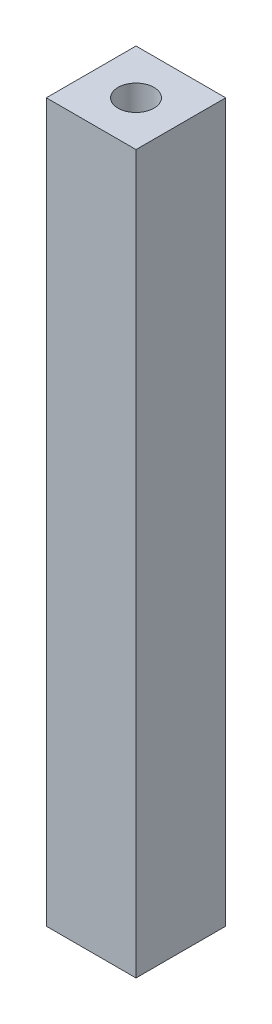
ISO-10303-21;
HEADER;
FILE_DESCRIPTION(('STEP AP214'),'2;1');
FILE_NAME('part.step','',(''),(''),'','','');
FILE_SCHEMA(('AUTOMOTIVE_DESIGN { 1 0 10303 214 1 1 1 1 }'));
ENDSEC;
DATA;
#1=APPLICATION_CONTEXT('core data for automotive mechanical design processes');
#2=APPLICATION_PROTOCOL_DEFINITION('international standard','automotive_design',2000,#1);
#3=PRODUCT_CONTEXT('',#1,'mechanical');
#4=PRODUCT('Part','Part','',(#3));
#5=PRODUCT_RELATED_PRODUCT_CATEGORY('part','',(#4));
#6=PRODUCT_DEFINITION_FORMATION('','',#4);
#7=PRODUCT_DEFINITION_CONTEXT('part definition',#1,'design');
#8=PRODUCT_DEFINITION('design','',#6,#7);
#9=PRODUCT_DEFINITION_SHAPE('','',#8);
#10=(LENGTH_UNIT() NAMED_UNIT(*) SI_UNIT(.MILLI.,.METRE.));
#11=(NAMED_UNIT(*) PLANE_ANGLE_UNIT() SI_UNIT($,.RADIAN.));
#12=(NAMED_UNIT(*) SI_UNIT($,.STERADIAN.) SOLID_ANGLE_UNIT());
#13=UNCERTAINTY_MEASURE_WITH_UNIT(LENGTH_MEASURE(1.E-05),#10,'distance_accuracy_value','');
#14=(GEOMETRIC_REPRESENTATION_CONTEXT(3) GLOBAL_UNCERTAINTY_ASSIGNED_CONTEXT((#13)) GLOBAL_UNIT_ASSIGNED_CONTEXT((#10,
#11,#12)) REPRESENTATION_CONTEXT('',''));
#15=CARTESIAN_POINT('',(0.,0.,0.));
#16=DIRECTION('',(0.,0.,1.));
#17=DIRECTION('',(1.,0.,0.));
#18=AXIS2_PLACEMENT_3D('',#15,#16,#17);
#19=CARTESIAN_POINT('',(0.,101.6,0.));
#20=DIRECTION('',(1.,0.,0.));
#21=DIRECTION('',(0.,0.,-1.));
#22=AXIS2_PLACEMENT_3D('',#19,#20,#21);
#23=PLANE('',#22);
#24=DIRECTION('',(0.,0.,1.));
#25=VECTOR('',#24,1.);
#26=CARTESIAN_POINT('',(0.,0.,0.));
#27=LINE('',#26,#25);
#28=CARTESIAN_POINT('',(0.,0.,0.));
#29=VERTEX_POINT('',#28);
#30=CARTESIAN_POINT('',(0.,0.,12.7));
#31=VERTEX_POINT('',#30);
#32=EDGE_CURVE('E110',#29,#31,#27,.T.);
#33=ORIENTED_EDGE('',*,*,#32,.T.);
#34=DIRECTION('',(0.,-1.,0.));
#35=VECTOR('',#34,1.);
#36=CARTESIAN_POINT('',(0.,101.6,12.7));
#37=LINE('',#36,#35);
#38=CARTESIAN_POINT('',(0.,101.6,12.7));
#39=VERTEX_POINT('',#38);
#40=EDGE_CURVE('E11',#39,#31,#37,.T.);
#41=ORIENTED_EDGE('',*,*,#40,.F.);
#42=DIRECTION('',(0.,0.,1.));
#43=VECTOR('',#42,1.);
#44=CARTESIAN_POINT('',(0.,101.6,0.));
#45=LINE('',#44,#43);
#46=CARTESIAN_POINT('',(0.,101.6,0.));
#47=VERTEX_POINT('',#46);
#48=EDGE_CURVE('E111',#47,#39,#45,.T.);
#49=ORIENTED_EDGE('',*,*,#48,.F.);
#50=DIRECTION('',(0.,-1.,0.));
#51=VECTOR('',#50,1.);
#52=CARTESIAN_POINT('',(0.,101.6,0.));
#53=LINE('',#52,#51);
#54=EDGE_CURVE('E117',#47,#29,#53,.T.);
#55=ORIENTED_EDGE('',*,*,#54,.T.);
#56=EDGE_LOOP('',(#33,#41,#49,#55));
#57=FACE_BOUND('',#56,.T.);
#58=ADVANCED_FACE('F35',(#57),#23,.F.);
#59=CARTESIAN_POINT('',(0.,101.6,12.7));
#60=DIRECTION('',(0.,0.,-1.));
#61=DIRECTION('',(-1.,0.,0.));
#62=AXIS2_PLACEMENT_3D('',#59,#60,#61);
#63=PLANE('',#62);
#64=DIRECTION('',(1.,0.,0.));
#65=VECTOR('',#64,1.);
#66=CARTESIAN_POINT('',(0.,0.,12.7));
#67=LINE('',#66,#65);
#68=CARTESIAN_POINT('',(12.7,0.,12.7));
#69=VERTEX_POINT('',#68);
#70=EDGE_CURVE('E120',#31,#69,#67,.T.);
#71=ORIENTED_EDGE('',*,*,#70,.T.);
#72=DIRECTION('',(0.,-1.,0.));
#73=VECTOR('',#72,1.);
#74=CARTESIAN_POINT('',(12.7,101.6,12.7));
#75=LINE('',#74,#73);
#76=CARTESIAN_POINT('',(12.7,101.6,12.7));
#77=VERTEX_POINT('',#76);
#78=EDGE_CURVE('E43',#77,#69,#75,.T.);
#79=ORIENTED_EDGE('',*,*,#78,.F.);
#80=DIRECTION('',(1.,0.,0.));
#81=VECTOR('',#80,1.);
#82=CARTESIAN_POINT('',(0.,101.6,12.7));
#83=LINE('',#82,#81);
#84=EDGE_CURVE('E82',#39,#77,#83,.T.);
#85=ORIENTED_EDGE('',*,*,#84,.F.);
#86=ORIENTED_EDGE('',*,*,#40,.T.);
#87=EDGE_LOOP('',(#71,#79,#85,#86));
#88=FACE_BOUND('',#87,.T.);
#89=ADVANCED_FACE('F144',(#88),#63,.F.);
#90=CARTESIAN_POINT('',(12.7,101.6,0.));
#91=DIRECTION('',(-1.,0.,0.));
#92=DIRECTION('',(0.,0.,1.));
#93=AXIS2_PLACEMENT_3D('',#90,#91,#92);
#94=PLANE('',#93);
#95=DIRECTION('',(0.,0.,-1.));
#96=VECTOR('',#95,1.);
#97=CARTESIAN_POINT('',(12.7,0.,0.));
#98=LINE('',#97,#96);
#99=CARTESIAN_POINT('',(12.7,0.,0.));
#100=VERTEX_POINT('',#99);
#101=EDGE_CURVE('E69',#69,#100,#98,.T.);
#102=ORIENTED_EDGE('',*,*,#101,.T.);
#103=DIRECTION('',(0.,-1.,0.));
#104=VECTOR('',#103,1.);
#105=CARTESIAN_POINT('',(12.7,101.6,0.));
#106=LINE('',#105,#104);
#107=CARTESIAN_POINT('',(12.7,101.6,0.));
#108=VERTEX_POINT('',#107);
#109=EDGE_CURVE('E125',#108,#100,#106,.T.);
#110=ORIENTED_EDGE('',*,*,#109,.F.);
#111=DIRECTION('',(0.,0.,-1.));
#112=VECTOR('',#111,1.);
#113=CARTESIAN_POINT('',(12.7,101.6,0.));
#114=LINE('',#113,#112);
#115=EDGE_CURVE('E114',#77,#108,#114,.T.);
#116=ORIENTED_EDGE('',*,*,#115,.F.);
#117=ORIENTED_EDGE('',*,*,#78,.T.);
#118=EDGE_LOOP('',(#102,#110,#116,#117));
#119=FACE_BOUND('',#118,.T.);
#120=ADVANCED_FACE('F127',(#119),#94,.F.);
#121=CARTESIAN_POINT('',(0.,101.6,0.));
#122=DIRECTION('',(0.,0.,1.));
#123=DIRECTION('',(1.,0.,0.));
#124=AXIS2_PLACEMENT_3D('',#121,#122,#123);
#125=PLANE('',#124);
#126=DIRECTION('',(-1.,0.,0.));
#127=VECTOR('',#126,1.);
#128=CARTESIAN_POINT('',(0.,0.,0.));
#129=LINE('',#128,#127);
#130=EDGE_CURVE('E75',#100,#29,#129,.T.);
#131=ORIENTED_EDGE('',*,*,#130,.T.);
#132=ORIENTED_EDGE('',*,*,#54,.F.);
#133=DIRECTION('',(-1.,0.,0.));
#134=VECTOR('',#133,1.);
#135=CARTESIAN_POINT('',(0.,101.6,0.));
#136=LINE('',#135,#134);
#137=EDGE_CURVE('E51',#108,#47,#136,.T.);
#138=ORIENTED_EDGE('',*,*,#137,.F.);
#139=ORIENTED_EDGE('',*,*,#109,.T.);
#140=EDGE_LOOP('',(#131,#132,#138,#139));
#141=FACE_BOUND('',#140,.T.);
#142=ADVANCED_FACE('F134',(#141),#125,.F.);
#143=CARTESIAN_POINT('',(0.,101.6,0.));
#144=DIRECTION('',(0.,1.,0.));
#145=DIRECTION('',(0.,0.,1.));
#146=AXIS2_PLACEMENT_3D('',#143,#144,#145);
#147=PLANE('',#146);
#148=CARTESIAN_POINT('',(6.35,101.6,6.35));
#149=DIRECTION('',(0.,1.,0.));
#150=DIRECTION('',(0.,0.,1.));
#151=AXIS2_PLACEMENT_3D('',#148,#149,#150);
#152=CIRCLE('',#151,2.55269999999999);
#153=CARTESIAN_POINT('',(6.35,101.6,8.90269999999999));
#154=VERTEX_POINT('',#153);
#155=EDGE_CURVE('E99',#154,#154,#152,.T.);
#156=ORIENTED_EDGE('',*,*,#155,.F.);
#157=EDGE_LOOP('',(#156));
#158=FACE_BOUND('',#157,.T.);
#159=ORIENTED_EDGE('',*,*,#48,.T.);
#160=ORIENTED_EDGE('',*,*,#84,.T.);
#161=ORIENTED_EDGE('',*,*,#115,.T.);
#162=ORIENTED_EDGE('',*,*,#137,.T.);
#163=EDGE_LOOP('',(#159,#160,#161,#162));
#164=FACE_BOUND('',#163,.T.);
#165=ADVANCED_FACE('F136',(#158,#164),#147,.T.);
#166=CARTESIAN_POINT('',(0.,0.,0.));
#167=DIRECTION('',(0.,1.,0.));
#168=DIRECTION('',(0.,0.,1.));
#169=AXIS2_PLACEMENT_3D('',#166,#167,#168);
#170=PLANE('',#169);
#171=CARTESIAN_POINT('',(6.35,0.,6.35));
#172=DIRECTION('',(0.,-1.,0.));
#173=DIRECTION('',(0.,0.,-1.));
#174=AXIS2_PLACEMENT_3D('',#171,#172,#173);
#175=CIRCLE('',#174,2.55269999999999);
#176=CARTESIAN_POINT('',(6.35,0.,3.79730000000001));
#177=VERTEX_POINT('',#176);
#178=EDGE_CURVE('E100',#177,#177,#175,.T.);
#179=ORIENTED_EDGE('',*,*,#178,.F.);
#180=EDGE_LOOP('',(#179));
#181=FACE_BOUND('',#180,.T.);
#182=ORIENTED_EDGE('',*,*,#32,.F.);
#183=ORIENTED_EDGE('',*,*,#130,.F.);
#184=ORIENTED_EDGE('',*,*,#101,.F.);
#185=ORIENTED_EDGE('',*,*,#70,.F.);
#186=EDGE_LOOP('',(#182,#183,#184,#185));
#187=FACE_BOUND('',#186,.T.);
#188=ADVANCED_FACE('F130',(#181,#187),#170,.F.);
#189=CARTESIAN_POINT('',(6.35,85.09,6.35));
#190=DIRECTION('',(0.,1.,0.));
#191=DIRECTION('',(0.,0.,1.));
#192=AXIS2_PLACEMENT_3D('',#189,#190,#191);
#193=CONICAL_SURFACE('',#192,2.55269999999999,1.02974425867665);
#194=CARTESIAN_POINT('',(6.35,83.5561830978084,6.35));
#195=VERTEX_POINT('',#194);
#196=VERTEX_LOOP('',#195);
#197=FACE_BOUND('',#196,.T.);
#198=CARTESIAN_POINT('',(6.35,85.09,6.35));
#199=DIRECTION('',(0.,1.,0.));
#200=DIRECTION('',(0.,0.,1.));
#201=AXIS2_PLACEMENT_3D('',#198,#199,#200);
#202=CIRCLE('',#201,2.55269999999999);
#203=CARTESIAN_POINT('',(6.35,85.09,8.90269999999999));
#204=VERTEX_POINT('',#203);
#205=EDGE_CURVE('E103',#204,#204,#202,.T.);
#206=ORIENTED_EDGE('',*,*,#205,.T.);
#207=EDGE_LOOP('',(#206));
#208=FACE_BOUND('',#207,.T.);
#209=ADVANCED_FACE('F176',(#197,#208),#193,.F.);
#210=CARTESIAN_POINT('',(6.35,101.6,6.35));
#211=DIRECTION('',(0.,1.,0.));
#212=DIRECTION('',(0.,0.,1.));
#213=AXIS2_PLACEMENT_3D('',#210,#211,#212);
#214=CYLINDRICAL_SURFACE('',#213,2.55269999999999);
#215=ORIENTED_EDGE('',*,*,#205,.F.);
#216=EDGE_LOOP('',(#215));
#217=FACE_BOUND('',#216,.T.);
#218=ORIENTED_EDGE('',*,*,#155,.T.);
#219=EDGE_LOOP('',(#218));
#220=FACE_BOUND('',#219,.T.);
#221=ADVANCED_FACE('F93',(#217,#220),#214,.F.);
#222=CARTESIAN_POINT('',(6.35,16.51,6.35));
#223=DIRECTION('',(0.,-1.,0.));
#224=DIRECTION('',(0.,0.,-1.));
#225=AXIS2_PLACEMENT_3D('',#222,#223,#224);
#226=CONICAL_SURFACE('',#225,2.55269999999999,1.02974425867665);
#227=CARTESIAN_POINT('',(6.35,18.0438169021916,6.35));
#228=VERTEX_POINT('',#227);
#229=VERTEX_LOOP('',#228);
#230=FACE_BOUND('',#229,.T.);
#231=CARTESIAN_POINT('',(6.35,16.51,6.35));
#232=DIRECTION('',(0.,-1.,0.));
#233=DIRECTION('',(0.,0.,-1.));
#234=AXIS2_PLACEMENT_3D('',#231,#232,#233);
#235=CIRCLE('',#234,2.55269999999999);
#236=CARTESIAN_POINT('',(6.35,16.51,3.79730000000001));
#237=VERTEX_POINT('',#236);
#238=EDGE_CURVE('E97',#237,#237,#235,.T.);
#239=ORIENTED_EDGE('',*,*,#238,.T.);
#240=EDGE_LOOP('',(#239));
#241=FACE_BOUND('',#240,.T.);
#242=ADVANCED_FACE('F89',(#230,#241),#226,.F.);
#243=CARTESIAN_POINT('',(6.35,0.,6.35));
#244=DIRECTION('',(0.,-1.,0.));
#245=DIRECTION('',(0.,0.,-1.));
#246=AXIS2_PLACEMENT_3D('',#243,#244,#245);
#247=CYLINDRICAL_SURFACE('',#246,2.55269999999999);
#248=ORIENTED_EDGE('',*,*,#238,.F.);
#249=EDGE_LOOP('',(#248));
#250=FACE_BOUND('',#249,.T.);
#251=ORIENTED_EDGE('',*,*,#178,.T.);
#252=EDGE_LOOP('',(#251));
#253=FACE_BOUND('',#252,.T.);
#254=ADVANCED_FACE('F92',(#250,#253),#247,.F.);
#255=CLOSED_SHELL('',(#58,#89,#120,#142,#165,#188,#209,#221,#242,#254));
#256=MANIFOLD_SOLID_BREP('B2',#255);
#257=ADVANCED_BREP_SHAPE_REPRESENTATION('',(#18,#256),#14);
#258=SHAPE_DEFINITION_REPRESENTATION(#9,#257);
ENDSEC;
END-ISO-10303-21;
